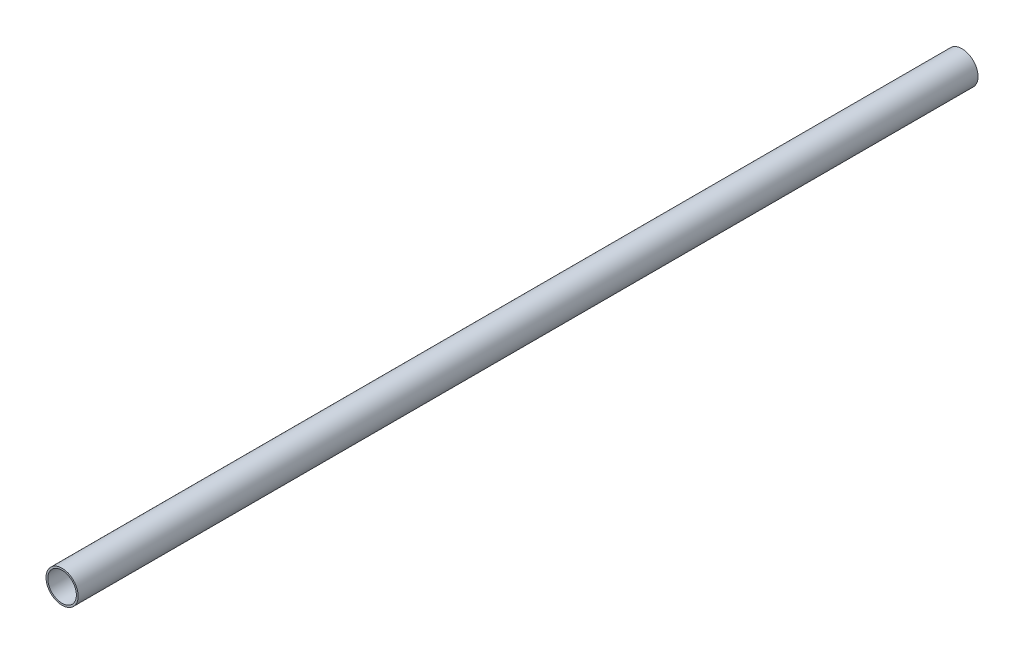
ISO-10303-21;
HEADER;
FILE_DESCRIPTION(('STEP AP214'),'2;1');
FILE_NAME('part.step','',(''),(''),'','','');
FILE_SCHEMA(('AUTOMOTIVE_DESIGN { 1 0 10303 214 1 1 1 1 }'));
ENDSEC;
DATA;
#1=APPLICATION_CONTEXT('core data for automotive mechanical design processes');
#2=APPLICATION_PROTOCOL_DEFINITION('international standard','automotive_design',2000,#1);
#3=PRODUCT_CONTEXT('',#1,'mechanical');
#4=PRODUCT('Part','Part','',(#3));
#5=PRODUCT_RELATED_PRODUCT_CATEGORY('part','',(#4));
#6=PRODUCT_DEFINITION_FORMATION('','',#4);
#7=PRODUCT_DEFINITION_CONTEXT('part definition',#1,'design');
#8=PRODUCT_DEFINITION('design','',#6,#7);
#9=PRODUCT_DEFINITION_SHAPE('','',#8);
#10=(LENGTH_UNIT() NAMED_UNIT(*) SI_UNIT(.MILLI.,.METRE.));
#11=(NAMED_UNIT(*) PLANE_ANGLE_UNIT() SI_UNIT($,.RADIAN.));
#12=(NAMED_UNIT(*) SI_UNIT($,.STERADIAN.) SOLID_ANGLE_UNIT());
#13=UNCERTAINTY_MEASURE_WITH_UNIT(LENGTH_MEASURE(1.E-05),#10,'distance_accuracy_value','');
#14=(GEOMETRIC_REPRESENTATION_CONTEXT(3) GLOBAL_UNCERTAINTY_ASSIGNED_CONTEXT((#13)) GLOBAL_UNIT_ASSIGNED_CONTEXT((#10,
#11,#12)) REPRESENTATION_CONTEXT('',''));
#15=CARTESIAN_POINT('',(0.,0.,0.));
#16=DIRECTION('',(0.,0.,1.));
#17=DIRECTION('',(1.,0.,0.));
#18=AXIS2_PLACEMENT_3D('',#15,#16,#17);
#19=CARTESIAN_POINT('',(0.,0.,0.));
#20=DIRECTION('',(0.,0.,1.));
#21=DIRECTION('',(1.,0.,0.));
#22=AXIS2_PLACEMENT_3D('',#19,#20,#21);
#23=PLANE('',#22);
#24=CARTESIAN_POINT('',(0.,0.,0.));
#25=DIRECTION('',(0.,0.,-1.));
#26=DIRECTION('',(1.,0.,0.));
#27=AXIS2_PLACEMENT_3D('',#24,#25,#26);
#28=CIRCLE('',#27,4.455);
#29=CARTESIAN_POINT('',(-4.455,0.,0.));
#30=VERTEX_POINT('',#29);
#31=EDGE_CURVE('E50',#30,#30,#28,.T.);
#32=ORIENTED_EDGE('',*,*,#31,.F.);
#33=EDGE_LOOP('',(#32));
#34=FACE_BOUND('',#33,.T.);
#35=CARTESIAN_POINT('',(0.,0.,0.));
#36=DIRECTION('',(0.,0.,1.));
#37=DIRECTION('',(1.,0.,0.));
#38=AXIS2_PLACEMENT_3D('',#35,#36,#37);
#39=CIRCLE('',#38,5.);
#40=CARTESIAN_POINT('',(-5.,0.,0.));
#41=VERTEX_POINT('',#40);
#42=EDGE_CURVE('E9',#41,#41,#39,.T.);
#43=ORIENTED_EDGE('',*,*,#42,.F.);
#44=EDGE_LOOP('',(#43));
#45=FACE_BOUND('',#44,.T.);
#46=ADVANCED_FACE('F14',(#34,#45),#23,.F.);
#47=CARTESIAN_POINT('',(0.,0.,280.));
#48=DIRECTION('',(0.,0.,1.));
#49=DIRECTION('',(1.,0.,0.));
#50=AXIS2_PLACEMENT_3D('',#47,#48,#49);
#51=PLANE('',#50);
#52=CARTESIAN_POINT('',(0.,0.,280.));
#53=DIRECTION('',(0.,0.,-1.));
#54=DIRECTION('',(1.,0.,0.));
#55=AXIS2_PLACEMENT_3D('',#52,#53,#54);
#56=CIRCLE('',#55,4.455);
#57=CARTESIAN_POINT('',(-4.455,0.,280.));
#58=VERTEX_POINT('',#57);
#59=EDGE_CURVE('E63',#58,#58,#56,.T.);
#60=ORIENTED_EDGE('',*,*,#59,.T.);
#61=EDGE_LOOP('',(#60));
#62=FACE_BOUND('',#61,.T.);
#63=CARTESIAN_POINT('',(0.,0.,280.));
#64=DIRECTION('',(0.,0.,1.));
#65=DIRECTION('',(1.,0.,0.));
#66=AXIS2_PLACEMENT_3D('',#63,#64,#65);
#67=CIRCLE('',#66,5.);
#68=CARTESIAN_POINT('',(-5.,0.,280.));
#69=VERTEX_POINT('',#68);
#70=EDGE_CURVE('E54',#69,#69,#67,.T.);
#71=ORIENTED_EDGE('',*,*,#70,.T.);
#72=EDGE_LOOP('',(#71));
#73=FACE_BOUND('',#72,.T.);
#74=ADVANCED_FACE('F16',(#62,#73),#51,.T.);
#75=CARTESIAN_POINT('',(0.,0.,0.));
#76=DIRECTION('',(0.,0.,1.));
#77=DIRECTION('',(1.,0.,0.));
#78=AXIS2_PLACEMENT_3D('',#75,#76,#77);
#79=CYLINDRICAL_SURFACE('',#78,5.);
#80=ORIENTED_EDGE('',*,*,#70,.F.);
#81=DIRECTION('',(0.,0.,-1.));
#82=VECTOR('',#81,1.);
#83=CARTESIAN_POINT('',(-5.,0.,0.));
#84=LINE('',#83,#82);
#85=EDGE_CURVE('E25',#69,#41,#84,.T.);
#86=ORIENTED_EDGE('',*,*,#85,.T.);
#87=ORIENTED_EDGE('',*,*,#42,.T.);
#88=ORIENTED_EDGE('',*,*,#85,.F.);
#89=EDGE_LOOP('',(#80,#86,#87,#88));
#90=FACE_BOUND('',#89,.T.);
#91=ADVANCED_FACE('F70',(#90),#79,.T.);
#92=CARTESIAN_POINT('',(0.,0.,0.));
#93=DIRECTION('',(0.,0.,1.));
#94=DIRECTION('',(1.,0.,0.));
#95=AXIS2_PLACEMENT_3D('',#92,#93,#94);
#96=CYLINDRICAL_SURFACE('',#95,4.455);
#97=ORIENTED_EDGE('',*,*,#59,.F.);
#98=DIRECTION('',(0.,0.,-1.));
#99=VECTOR('',#98,1.);
#100=CARTESIAN_POINT('',(-4.455,0.,0.));
#101=LINE('',#100,#99);
#102=EDGE_CURVE('E18',#58,#30,#101,.T.);
#103=ORIENTED_EDGE('',*,*,#102,.T.);
#104=ORIENTED_EDGE('',*,*,#31,.T.);
#105=ORIENTED_EDGE('',*,*,#102,.F.);
#106=EDGE_LOOP('',(#97,#103,#104,#105));
#107=FACE_BOUND('',#106,.T.);
#108=ADVANCED_FACE('F51',(#107),#96,.F.);
#109=CLOSED_SHELL('',(#46,#74,#91,#108));
#110=MANIFOLD_SOLID_BREP('B1',#109);
#111=ADVANCED_BREP_SHAPE_REPRESENTATION('',(#18,#110),#14);
#112=SHAPE_DEFINITION_REPRESENTATION(#9,#111);
ENDSEC;
END-ISO-10303-21;
